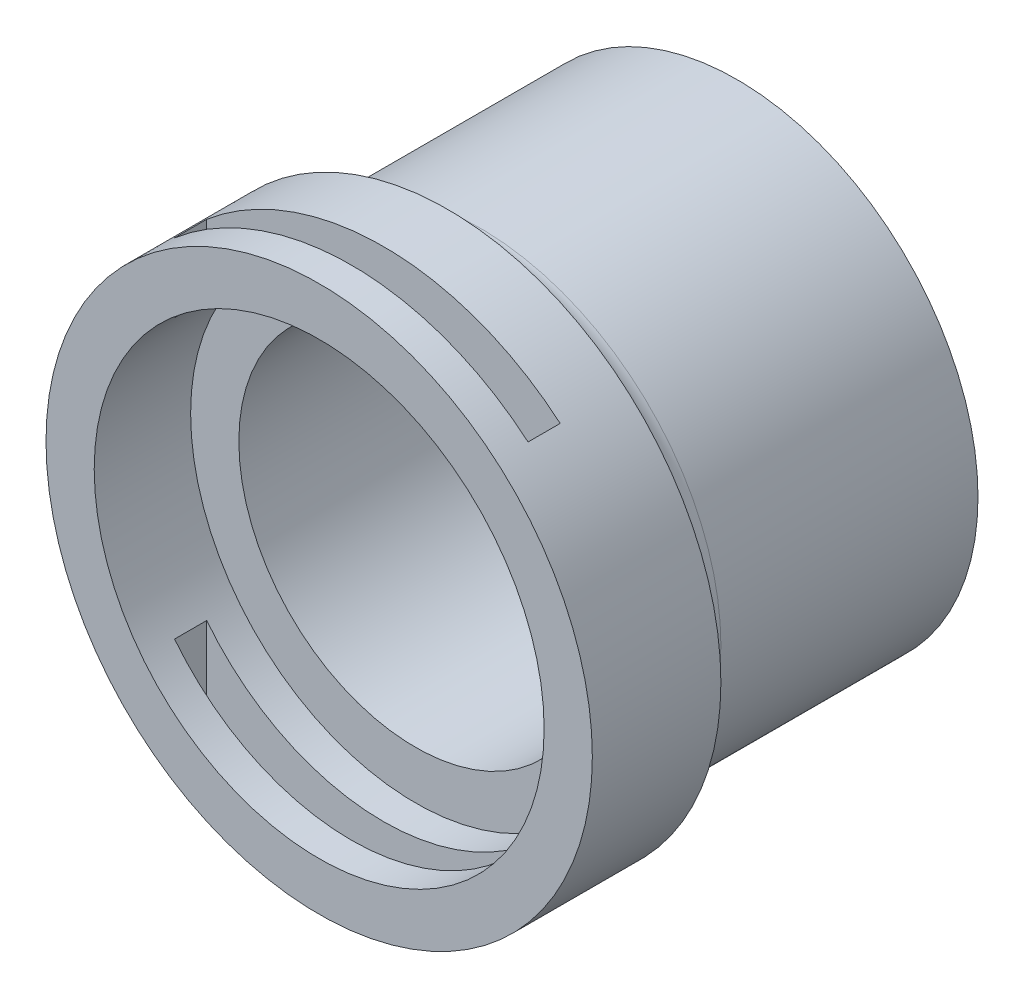
ISO-10303-21;
HEADER;
FILE_DESCRIPTION(('STEP AP214'),'2;1');
FILE_NAME('part.step','',(''),(''),'','','');
FILE_SCHEMA(('AUTOMOTIVE_DESIGN { 1 0 10303 214 1 1 1 1 }'));
ENDSEC;
DATA;
#1=APPLICATION_CONTEXT('core data for automotive mechanical design processes');
#2=APPLICATION_PROTOCOL_DEFINITION('international standard','automotive_design',2000,#1);
#3=PRODUCT_CONTEXT('',#1,'mechanical');
#4=PRODUCT('Part','Part','',(#3));
#5=PRODUCT_RELATED_PRODUCT_CATEGORY('part','',(#4));
#6=PRODUCT_DEFINITION_FORMATION('','',#4);
#7=PRODUCT_DEFINITION_CONTEXT('part definition',#1,'design');
#8=PRODUCT_DEFINITION('design','',#6,#7);
#9=PRODUCT_DEFINITION_SHAPE('','',#8);
#10=(LENGTH_UNIT() NAMED_UNIT(*) SI_UNIT(.MILLI.,.METRE.));
#11=(NAMED_UNIT(*) PLANE_ANGLE_UNIT() SI_UNIT($,.RADIAN.));
#12=(NAMED_UNIT(*) SI_UNIT($,.STERADIAN.) SOLID_ANGLE_UNIT());
#13=UNCERTAINTY_MEASURE_WITH_UNIT(LENGTH_MEASURE(1.E-05),#10,'distance_accuracy_value','');
#14=(GEOMETRIC_REPRESENTATION_CONTEXT(3) GLOBAL_UNCERTAINTY_ASSIGNED_CONTEXT((#13)) GLOBAL_UNIT_ASSIGNED_CONTEXT((#10,
#11,#12)) REPRESENTATION_CONTEXT('',''));
#15=CARTESIAN_POINT('',(0.,0.,0.));
#16=DIRECTION('',(0.,0.,1.));
#17=DIRECTION('',(1.,0.,0.));
#18=AXIS2_PLACEMENT_3D('',#15,#16,#17);
#19=CARTESIAN_POINT('',(0.,0.,0.));
#20=DIRECTION('',(0.,0.,1.));
#21=DIRECTION('',(1.,0.,0.));
#22=AXIS2_PLACEMENT_3D('',#19,#20,#21);
#23=PLANE('',#22);
#24=CARTESIAN_POINT('',(0.,10.,0.));
#25=DIRECTION('',(0.,0.,1.));
#26=DIRECTION('',(1.,0.,0.));
#27=AXIS2_PLACEMENT_3D('',#24,#25,#26);
#28=CIRCLE('',#27,0.5);
#29=CARTESIAN_POINT('',(0.5,10.,0.));
#30=VERTEX_POINT('',#29);
#31=EDGE_CURVE('E138',#30,#30,#28,.T.);
#32=ORIENTED_EDGE('',*,*,#31,.T.);
#33=EDGE_LOOP('',(#32));
#34=FACE_BOUND('',#33,.T.);
#35=CARTESIAN_POINT('',(0.,-10.,0.));
#36=DIRECTION('',(0.,0.,1.));
#37=DIRECTION('',(1.,0.,0.));
#38=AXIS2_PLACEMENT_3D('',#35,#36,#37);
#39=CIRCLE('',#38,0.5);
#40=CARTESIAN_POINT('',(0.5,-10.,0.));
#41=VERTEX_POINT('',#40);
#42=EDGE_CURVE('E146',#41,#41,#39,.T.);
#43=ORIENTED_EDGE('',*,*,#42,.T.);
#44=EDGE_LOOP('',(#43));
#45=FACE_BOUND('',#44,.T.);
#46=CARTESIAN_POINT('',(0.,0.,0.));
#47=DIRECTION('',(0.,0.,1.));
#48=DIRECTION('',(1.,0.,0.));
#49=AXIS2_PLACEMENT_3D('',#46,#47,#48);
#50=CIRCLE('',#49,5.625);
#51=CARTESIAN_POINT('',(5.625,0.,0.));
#52=VERTEX_POINT('',#51);
#53=EDGE_CURVE('E173',#52,#52,#50,.T.);
#54=ORIENTED_EDGE('',*,*,#53,.T.);
#55=EDGE_LOOP('',(#54));
#56=FACE_BOUND('',#55,.T.);
#57=CARTESIAN_POINT('',(0.,0.,0.));
#58=DIRECTION('',(0.,0.,1.));
#59=DIRECTION('',(1.,0.,0.));
#60=AXIS2_PLACEMENT_3D('',#57,#58,#59);
#61=CIRCLE('',#60,15.);
#62=CARTESIAN_POINT('',(15.,0.,0.));
#63=VERTEX_POINT('',#62);
#64=EDGE_CURVE('E176',#63,#63,#61,.T.);
#65=ORIENTED_EDGE('',*,*,#64,.F.);
#66=EDGE_LOOP('',(#65));
#67=FACE_BOUND('',#66,.T.);
#68=CARTESIAN_POINT('',(10.,0.,0.));
#69=DIRECTION('',(0.,0.,1.));
#70=DIRECTION('',(1.,0.,0.));
#71=AXIS2_PLACEMENT_3D('',#68,#69,#70);
#72=CIRCLE('',#71,0.500000000000001);
#73=CARTESIAN_POINT('',(10.5,0.,0.));
#74=VERTEX_POINT('',#73);
#75=EDGE_CURVE('E142',#74,#74,#72,.T.);
#76=ORIENTED_EDGE('',*,*,#75,.T.);
#77=EDGE_LOOP('',(#76));
#78=FACE_BOUND('',#77,.T.);
#79=CARTESIAN_POINT('',(-10.,0.,0.));
#80=DIRECTION('',(0.,0.,1.));
#81=DIRECTION('',(1.,0.,0.));
#82=AXIS2_PLACEMENT_3D('',#79,#80,#81);
#83=CIRCLE('',#82,0.500000000000001);
#84=CARTESIAN_POINT('',(-9.5,0.,0.));
#85=VERTEX_POINT('',#84);
#86=EDGE_CURVE('E134',#85,#85,#83,.T.);
#87=ORIENTED_EDGE('',*,*,#86,.T.);
#88=EDGE_LOOP('',(#87));
#89=FACE_BOUND('',#88,.T.);
#90=ADVANCED_FACE('F33',(#34,#45,#56,#67,#78,#89),#23,.F.);
#91=CARTESIAN_POINT('',(0.,0.,3.99999999999999));
#92=DIRECTION('',(0.,0.,1.));
#93=DIRECTION('',(1.,0.,0.));
#94=AXIS2_PLACEMENT_3D('',#91,#92,#93);
#95=PLANE('',#94);
#96=CARTESIAN_POINT('',(0.,10.,4.));
#97=DIRECTION('',(0.,0.,1.));
#98=DIRECTION('',(1.,0.,0.));
#99=AXIS2_PLACEMENT_3D('',#96,#97,#98);
#100=CIRCLE('',#99,0.5);
#101=CARTESIAN_POINT('',(0.5,10.,4.));
#102=VERTEX_POINT('',#101);
#103=EDGE_CURVE('E141',#102,#102,#100,.F.);
#104=ORIENTED_EDGE('',*,*,#103,.T.);
#105=EDGE_LOOP('',(#104));
#106=FACE_BOUND('',#105,.T.);
#107=CARTESIAN_POINT('',(0.,-10.,4.));
#108=DIRECTION('',(0.,0.,1.));
#109=DIRECTION('',(1.,0.,0.));
#110=AXIS2_PLACEMENT_3D('',#107,#108,#109);
#111=CIRCLE('',#110,0.5);
#112=CARTESIAN_POINT('',(0.5,-10.,4.));
#113=VERTEX_POINT('',#112);
#114=EDGE_CURVE('E149',#113,#113,#111,.F.);
#115=ORIENTED_EDGE('',*,*,#114,.T.);
#116=EDGE_LOOP('',(#115));
#117=FACE_BOUND('',#116,.T.);
#118=CARTESIAN_POINT('',(0.,0.,3.99999999999999));
#119=DIRECTION('',(0.,0.,1.));
#120=DIRECTION('',(1.,0.,0.));
#121=AXIS2_PLACEMENT_3D('',#118,#119,#120);
#122=CIRCLE('',#121,9.);
#123=CARTESIAN_POINT('',(9.,0.,3.99999999999999));
#124=VERTEX_POINT('',#123);
#125=EDGE_CURVE('E164',#124,#124,#122,.T.);
#126=ORIENTED_EDGE('',*,*,#125,.F.);
#127=EDGE_LOOP('',(#126));
#128=FACE_BOUND('',#127,.T.);
#129=CARTESIAN_POINT('',(0.,0.,3.99999999999999));
#130=DIRECTION('',(0.,0.,1.));
#131=DIRECTION('',(1.,0.,0.));
#132=AXIS2_PLACEMENT_3D('',#129,#130,#131);
#133=CIRCLE('',#132,11.);
#134=CARTESIAN_POINT('',(11.,0.,3.99999999999999));
#135=VERTEX_POINT('',#134);
#136=EDGE_CURVE('E167',#135,#135,#133,.T.);
#137=ORIENTED_EDGE('',*,*,#136,.T.);
#138=EDGE_LOOP('',(#137));
#139=FACE_BOUND('',#138,.T.);
#140=CARTESIAN_POINT('',(10.,0.,4.));
#141=DIRECTION('',(0.,0.,1.));
#142=DIRECTION('',(1.,0.,0.));
#143=AXIS2_PLACEMENT_3D('',#140,#141,#142);
#144=CIRCLE('',#143,0.500000000000001);
#145=CARTESIAN_POINT('',(10.5,0.,4.));
#146=VERTEX_POINT('',#145);
#147=EDGE_CURVE('E145',#146,#146,#144,.F.);
#148=ORIENTED_EDGE('',*,*,#147,.T.);
#149=EDGE_LOOP('',(#148));
#150=FACE_BOUND('',#149,.T.);
#151=CARTESIAN_POINT('',(-10.,0.,4.));
#152=DIRECTION('',(0.,0.,1.));
#153=DIRECTION('',(1.,0.,0.));
#154=AXIS2_PLACEMENT_3D('',#151,#152,#153);
#155=CIRCLE('',#154,0.500000000000001);
#156=CARTESIAN_POINT('',(-9.5,0.,4.));
#157=VERTEX_POINT('',#156);
#158=EDGE_CURVE('E137',#157,#157,#155,.F.);
#159=ORIENTED_EDGE('',*,*,#158,.T.);
#160=EDGE_LOOP('',(#159));
#161=FACE_BOUND('',#160,.T.);
#162=ADVANCED_FACE('F248',(#106,#117,#128,#139,#150,#161),#95,.T.);
#163=CARTESIAN_POINT('',(0.,0.,54.));
#164=DIRECTION('',(0.,0.,-1.));
#165=DIRECTION('',(-1.,0.,0.));
#166=AXIS2_PLACEMENT_3D('',#163,#164,#165);
#167=CYLINDRICAL_SURFACE('',#166,11.);
#168=ORIENTED_EDGE('',*,*,#136,.F.);
#169=EDGE_LOOP('',(#168));
#170=FACE_BOUND('',#169,.T.);
#171=CARTESIAN_POINT('',(0.,0.,20.));
#172=DIRECTION('',(0.,0.,1.));
#173=DIRECTION('',(1.,0.,0.));
#174=AXIS2_PLACEMENT_3D('',#171,#172,#173);
#175=CIRCLE('',#174,11.);
#176=CARTESIAN_POINT('',(11.,0.,20.));
#177=VERTEX_POINT('',#176);
#178=EDGE_CURVE('E153',#177,#177,#175,.T.);
#179=ORIENTED_EDGE('',*,*,#178,.T.);
#180=EDGE_LOOP('',(#179));
#181=FACE_BOUND('',#180,.T.);
#182=ADVANCED_FACE('F254',(#170,#181),#167,.F.);
#183=CARTESIAN_POINT('',(0.,0.,26.));
#184=DIRECTION('',(0.,0.,1.));
#185=DIRECTION('',(1.,0.,0.));
#186=AXIS2_PLACEMENT_3D('',#183,#184,#185);
#187=PLANE('',#186);
#188=CARTESIAN_POINT('',(0.,0.,26.));
#189=DIRECTION('',(0.,0.,1.));
#190=DIRECTION('',(1.,0.,0.));
#191=AXIS2_PLACEMENT_3D('',#188,#189,#190);
#192=CIRCLE('',#191,14.);
#193=CARTESIAN_POINT('',(14.,0.,26.));
#194=VERTEX_POINT('',#193);
#195=EDGE_CURVE('E154',#194,#194,#192,.T.);
#196=ORIENTED_EDGE('',*,*,#195,.F.);
#197=EDGE_LOOP('',(#196));
#198=FACE_BOUND('',#197,.T.);
#199=CARTESIAN_POINT('',(0.,0.,26.));
#200=DIRECTION('',(0.,0.,1.));
#201=DIRECTION('',(1.,0.,0.));
#202=AXIS2_PLACEMENT_3D('',#199,#200,#201);
#203=CIRCLE('',#202,17.);
#204=CARTESIAN_POINT('',(17.,0.,26.));
#205=VERTEX_POINT('',#204);
#206=EDGE_CURVE('E157',#205,#205,#203,.T.);
#207=ORIENTED_EDGE('',*,*,#206,.T.);
#208=EDGE_LOOP('',(#207));
#209=FACE_BOUND('',#208,.T.);
#210=ADVANCED_FACE('F259',(#198,#209),#187,.T.);
#211=CARTESIAN_POINT('',(0.,0.,26.));
#212=DIRECTION('',(0.,0.,-1.));
#213=DIRECTION('',(-1.,0.,0.));
#214=AXIS2_PLACEMENT_3D('',#211,#212,#213);
#215=CYLINDRICAL_SURFACE('',#214,15.);
#216=CARTESIAN_POINT('',(0.,0.,16.));
#217=DIRECTION('',(0.,0.,1.));
#218=DIRECTION('',(1.,0.,0.));
#219=AXIS2_PLACEMENT_3D('',#216,#217,#218);
#220=CIRCLE('',#219,15.);
#221=CARTESIAN_POINT('',(15.,0.,16.));
#222=VERTEX_POINT('',#221);
#223=EDGE_CURVE('E179',#222,#222,#220,.F.);
#224=ORIENTED_EDGE('',*,*,#223,.T.);
#225=EDGE_LOOP('',(#224));
#226=FACE_BOUND('',#225,.T.);
#227=ORIENTED_EDGE('',*,*,#64,.T.);
#228=EDGE_LOOP('',(#227));
#229=FACE_BOUND('',#228,.T.);
#230=ADVANCED_FACE('F261',(#226,#229),#215,.T.);
#231=CARTESIAN_POINT('',(0.,0.,5.99999999999999));
#232=DIRECTION('',(0.,0.,1.));
#233=DIRECTION('',(1.,0.,0.));
#234=AXIS2_PLACEMENT_3D('',#231,#232,#233);
#235=PLANE('',#234);
#236=CARTESIAN_POINT('',(0.,0.,5.99999999999999));
#237=DIRECTION('',(0.,0.,1.));
#238=DIRECTION('',(1.,0.,0.));
#239=AXIS2_PLACEMENT_3D('',#236,#237,#238);
#240=CIRCLE('',#239,5.625);
#241=CARTESIAN_POINT('',(5.625,0.,5.99999999999999));
#242=VERTEX_POINT('',#241);
#243=EDGE_CURVE('E172',#242,#242,#240,.F.);
#244=ORIENTED_EDGE('',*,*,#243,.T.);
#245=EDGE_LOOP('',(#244));
#246=FACE_BOUND('',#245,.T.);
#247=CARTESIAN_POINT('',(0.,0.,5.99999999999999));
#248=DIRECTION('',(0.,0.,1.));
#249=DIRECTION('',(1.,0.,0.));
#250=AXIS2_PLACEMENT_3D('',#247,#248,#249);
#251=CIRCLE('',#250,9.);
#252=CARTESIAN_POINT('',(9.,0.,5.99999999999999));
#253=VERTEX_POINT('',#252);
#254=EDGE_CURVE('E163',#253,#253,#251,.T.);
#255=ORIENTED_EDGE('',*,*,#254,.T.);
#256=EDGE_LOOP('',(#255));
#257=FACE_BOUND('',#256,.T.);
#258=ADVANCED_FACE('F263',(#246,#257),#235,.T.);
#259=CARTESIAN_POINT('',(0.,0.,0.));
#260=DIRECTION('',(0.,0.,1.));
#261=DIRECTION('',(1.,0.,0.));
#262=AXIS2_PLACEMENT_3D('',#259,#260,#261);
#263=CYLINDRICAL_SURFACE('',#262,5.625);
#264=ORIENTED_EDGE('',*,*,#53,.F.);
#265=EDGE_LOOP('',(#264));
#266=FACE_BOUND('',#265,.T.);
#267=ORIENTED_EDGE('',*,*,#243,.F.);
#268=EDGE_LOOP('',(#267));
#269=FACE_BOUND('',#268,.T.);
#270=ADVANCED_FACE('F269',(#266,#269),#263,.F.);
#271=CARTESIAN_POINT('',(0.,0.,3.99999999999999));
#272=DIRECTION('',(0.,0.,1.));
#273=DIRECTION('',(1.,0.,0.));
#274=AXIS2_PLACEMENT_3D('',#271,#272,#273);
#275=CYLINDRICAL_SURFACE('',#274,9.);
#276=ORIENTED_EDGE('',*,*,#125,.T.);
#277=EDGE_LOOP('',(#276));
#278=FACE_BOUND('',#277,.T.);
#279=ORIENTED_EDGE('',*,*,#254,.F.);
#280=EDGE_LOOP('',(#279));
#281=FACE_BOUND('',#280,.T.);
#282=ADVANCED_FACE('F310',(#278,#281),#275,.T.);
#283=CARTESIAN_POINT('',(0.,0.,18.));
#284=DIRECTION('',(0.,0.,1.));
#285=DIRECTION('',(1.,0.,0.));
#286=AXIS2_PLACEMENT_3D('',#283,#284,#285);
#287=CYLINDRICAL_SURFACE('',#286,17.);
#288=CARTESIAN_POINT('',(0.,0.,24.));
#289=DIRECTION('',(0.,0.,1.));
#290=DIRECTION('',(1.,0.,0.));
#291=AXIS2_PLACEMENT_3D('',#288,#289,#290);
#292=CIRCLE('',#291,17.);
#293=CARTESIAN_POINT('',(11.,-12.9614813968157,24.));
#294=VERTEX_POINT('',#293);
#295=CARTESIAN_POINT('',(-11.,-12.9614813968157,24.));
#296=VERTEX_POINT('',#295);
#297=EDGE_CURVE('E110',#294,#296,#292,.F.);
#298=ORIENTED_EDGE('',*,*,#297,.F.);
#299=DIRECTION('',(0.,0.,1.));
#300=VECTOR('',#299,1.);
#301=CARTESIAN_POINT('',(11.,-12.9614813968157,18.));
#302=LINE('',#301,#300);
#303=CARTESIAN_POINT('',(11.,-12.9614813968157,22.));
#304=VERTEX_POINT('',#303);
#305=EDGE_CURVE('E99',#304,#294,#302,.T.);
#306=ORIENTED_EDGE('',*,*,#305,.F.);
#307=CARTESIAN_POINT('',(0.,0.,22.));
#308=DIRECTION('',(0.,0.,-1.));
#309=DIRECTION('',(-1.,0.,0.));
#310=AXIS2_PLACEMENT_3D('',#307,#308,#309);
#311=CIRCLE('',#310,17.);
#312=CARTESIAN_POINT('',(-11.,-12.9614813968157,22.));
#313=VERTEX_POINT('',#312);
#314=EDGE_CURVE('E129',#313,#304,#311,.F.);
#315=ORIENTED_EDGE('',*,*,#314,.F.);
#316=DIRECTION('',(0.,0.,1.));
#317=VECTOR('',#316,1.);
#318=CARTESIAN_POINT('',(-11.,-12.9614813968157,18.));
#319=LINE('',#318,#317);
#320=EDGE_CURVE('E120',#296,#313,#319,.F.);
#321=ORIENTED_EDGE('',*,*,#320,.F.);
#322=EDGE_LOOP('',(#298,#306,#315,#321));
#323=FACE_BOUND('',#322,.T.);
#324=CARTESIAN_POINT('',(-11.,12.9614813968157,24.));
#325=VERTEX_POINT('',#324);
#326=CARTESIAN_POINT('',(11.,12.9614813968157,24.));
#327=VERTEX_POINT('',#326);
#328=EDGE_CURVE('E121',#325,#327,#292,.F.);
#329=ORIENTED_EDGE('',*,*,#328,.F.);
#330=DIRECTION('',(0.,0.,1.));
#331=VECTOR('',#330,1.);
#332=CARTESIAN_POINT('',(-11.,12.9614813968157,18.));
#333=LINE('',#332,#331);
#334=CARTESIAN_POINT('',(-11.,12.9614813968157,22.));
#335=VERTEX_POINT('',#334);
#336=EDGE_CURVE('E131',#335,#325,#333,.T.);
#337=ORIENTED_EDGE('',*,*,#336,.F.);
#338=CARTESIAN_POINT('',(11.,12.9614813968157,22.));
#339=VERTEX_POINT('',#338);
#340=EDGE_CURVE('E128',#339,#335,#311,.F.);
#341=ORIENTED_EDGE('',*,*,#340,.F.);
#342=DIRECTION('',(0.,0.,1.));
#343=VECTOR('',#342,1.);
#344=CARTESIAN_POINT('',(11.,12.9614813968157,18.));
#345=LINE('',#344,#343);
#346=EDGE_CURVE('E109',#327,#339,#345,.F.);
#347=ORIENTED_EDGE('',*,*,#346,.F.);
#348=EDGE_LOOP('',(#329,#337,#341,#347));
#349=FACE_BOUND('',#348,.T.);
#350=CARTESIAN_POINT('',(0.,0.,18.));
#351=DIRECTION('',(0.,0.,1.));
#352=DIRECTION('',(1.,0.,0.));
#353=AXIS2_PLACEMENT_3D('',#350,#351,#352);
#354=CIRCLE('',#353,17.);
#355=CARTESIAN_POINT('',(17.,0.,18.));
#356=VERTEX_POINT('',#355);
#357=EDGE_CURVE('E160',#356,#356,#354,.T.);
#358=ORIENTED_EDGE('',*,*,#357,.T.);
#359=EDGE_LOOP('',(#358));
#360=FACE_BOUND('',#359,.T.);
#361=ORIENTED_EDGE('',*,*,#206,.F.);
#362=EDGE_LOOP('',(#361));
#363=FACE_BOUND('',#362,.T.);
#364=ADVANCED_FACE('F118',(#323,#349,#360,#363),#287,.T.);
#365=CARTESIAN_POINT('',(0.,0.,16.));
#366=DIRECTION('',(0.,0.,1.));
#367=DIRECTION('',(1.,0.,0.));
#368=AXIS2_PLACEMENT_3D('',#365,#366,#367);
#369=TOROIDAL_SURFACE('',#368,17.,2.);
#370=ORIENTED_EDGE('',*,*,#223,.F.);
#371=EDGE_LOOP('',(#370));
#372=FACE_BOUND('',#371,.T.);
#373=ORIENTED_EDGE('',*,*,#357,.F.);
#374=EDGE_LOOP('',(#373));
#375=FACE_BOUND('',#374,.T.);
#376=ADVANCED_FACE('F35',(#372,#375),#369,.F.);
#377=CARTESIAN_POINT('',(0.,0.,20.));
#378=DIRECTION('',(0.,0.,1.));
#379=DIRECTION('',(1.,0.,0.));
#380=AXIS2_PLACEMENT_3D('',#377,#378,#379);
#381=CYLINDRICAL_SURFACE('',#380,14.);
#382=CARTESIAN_POINT('',(0.,0.,24.));
#383=DIRECTION('',(0.,0.,1.));
#384=DIRECTION('',(1.,0.,0.));
#385=AXIS2_PLACEMENT_3D('',#382,#383,#384);
#386=CIRCLE('',#385,14.);
#387=CARTESIAN_POINT('',(11.,-8.66025403784439,24.));
#388=VERTEX_POINT('',#387);
#389=CARTESIAN_POINT('',(-11.,-8.66025403784439,24.));
#390=VERTEX_POINT('',#389);
#391=EDGE_CURVE('E114',#388,#390,#386,.F.);
#392=ORIENTED_EDGE('',*,*,#391,.T.);
#393=DIRECTION('',(0.,0.,1.));
#394=VECTOR('',#393,1.);
#395=CARTESIAN_POINT('',(-11.,-8.66025403784439,20.));
#396=LINE('',#395,#394);
#397=CARTESIAN_POINT('',(-11.,-8.66025403784439,22.));
#398=VERTEX_POINT('',#397);
#399=EDGE_CURVE('E11',#390,#398,#396,.F.);
#400=ORIENTED_EDGE('',*,*,#399,.T.);
#401=CARTESIAN_POINT('',(0.,0.,22.));
#402=DIRECTION('',(0.,0.,-1.));
#403=DIRECTION('',(-1.,0.,0.));
#404=AXIS2_PLACEMENT_3D('',#401,#402,#403);
#405=CIRCLE('',#404,14.);
#406=CARTESIAN_POINT('',(11.,-8.66025403784439,22.));
#407=VERTEX_POINT('',#406);
#408=EDGE_CURVE('E41',#398,#407,#405,.F.);
#409=ORIENTED_EDGE('',*,*,#408,.T.);
#410=DIRECTION('',(0.,0.,1.));
#411=VECTOR('',#410,1.);
#412=CARTESIAN_POINT('',(11.,-8.66025403784439,20.));
#413=LINE('',#412,#411);
#414=EDGE_CURVE('E205',#407,#388,#413,.T.);
#415=ORIENTED_EDGE('',*,*,#414,.T.);
#416=EDGE_LOOP('',(#392,#400,#409,#415));
#417=FACE_BOUND('',#416,.T.);
#418=CARTESIAN_POINT('',(11.,8.66025403784439,22.));
#419=VERTEX_POINT('',#418);
#420=CARTESIAN_POINT('',(-11.,8.66025403784439,22.));
#421=VERTEX_POINT('',#420);
#422=EDGE_CURVE('E200',#419,#421,#405,.F.);
#423=ORIENTED_EDGE('',*,*,#422,.T.);
#424=DIRECTION('',(0.,0.,1.));
#425=VECTOR('',#424,1.);
#426=CARTESIAN_POINT('',(-11.,8.66025403784439,20.));
#427=LINE('',#426,#425);
#428=CARTESIAN_POINT('',(-11.,8.66025403784439,24.));
#429=VERTEX_POINT('',#428);
#430=EDGE_CURVE('E203',#421,#429,#427,.T.);
#431=ORIENTED_EDGE('',*,*,#430,.T.);
#432=CARTESIAN_POINT('',(11.,8.66025403784439,24.));
#433=VERTEX_POINT('',#432);
#434=EDGE_CURVE('E184',#429,#433,#386,.F.);
#435=ORIENTED_EDGE('',*,*,#434,.T.);
#436=DIRECTION('',(0.,0.,1.));
#437=VECTOR('',#436,1.);
#438=CARTESIAN_POINT('',(11.,8.66025403784439,20.));
#439=LINE('',#438,#437);
#440=EDGE_CURVE('E197',#433,#419,#439,.F.);
#441=ORIENTED_EDGE('',*,*,#440,.T.);
#442=EDGE_LOOP('',(#423,#431,#435,#441));
#443=FACE_BOUND('',#442,.T.);
#444=CARTESIAN_POINT('',(0.,0.,20.));
#445=DIRECTION('',(0.,0.,1.));
#446=DIRECTION('',(1.,0.,0.));
#447=AXIS2_PLACEMENT_3D('',#444,#445,#446);
#448=CIRCLE('',#447,14.);
#449=CARTESIAN_POINT('',(14.,0.,20.));
#450=VERTEX_POINT('',#449);
#451=EDGE_CURVE('E150',#450,#450,#448,.T.);
#452=ORIENTED_EDGE('',*,*,#451,.F.);
#453=EDGE_LOOP('',(#452));
#454=FACE_BOUND('',#453,.T.);
#455=ORIENTED_EDGE('',*,*,#195,.T.);
#456=EDGE_LOOP('',(#455));
#457=FACE_BOUND('',#456,.T.);
#458=ADVANCED_FACE('F208',(#417,#443,#454,#457),#381,.F.);
#459=CARTESIAN_POINT('',(0.,0.,20.));
#460=DIRECTION('',(0.,0.,1.));
#461=DIRECTION('',(1.,0.,0.));
#462=AXIS2_PLACEMENT_3D('',#459,#460,#461);
#463=PLANE('',#462);
#464=ORIENTED_EDGE('',*,*,#178,.F.);
#465=EDGE_LOOP('',(#464));
#466=FACE_BOUND('',#465,.T.);
#467=ORIENTED_EDGE('',*,*,#451,.T.);
#468=EDGE_LOOP('',(#467));
#469=FACE_BOUND('',#468,.T.);
#470=ADVANCED_FACE('F301',(#466,#469),#463,.T.);
#471=CARTESIAN_POINT('',(0.,-10.,26.));
#472=DIRECTION('',(0.,0.,-1.));
#473=DIRECTION('',(-1.,0.,0.));
#474=AXIS2_PLACEMENT_3D('',#471,#472,#473);
#475=CYLINDRICAL_SURFACE('',#474,0.5);
#476=ORIENTED_EDGE('',*,*,#114,.F.);
#477=EDGE_LOOP('',(#476));
#478=FACE_BOUND('',#477,.T.);
#479=ORIENTED_EDGE('',*,*,#42,.F.);
#480=EDGE_LOOP('',(#479));
#481=FACE_BOUND('',#480,.T.);
#482=ADVANCED_FACE('F297',(#478,#481),#475,.F.);
#483=CARTESIAN_POINT('',(10.,0.,26.));
#484=DIRECTION('',(0.,0.,-1.));
#485=DIRECTION('',(-1.,0.,0.));
#486=AXIS2_PLACEMENT_3D('',#483,#484,#485);
#487=CYLINDRICAL_SURFACE('',#486,0.500000000000001);
#488=ORIENTED_EDGE('',*,*,#147,.F.);
#489=EDGE_LOOP('',(#488));
#490=FACE_BOUND('',#489,.T.);
#491=ORIENTED_EDGE('',*,*,#75,.F.);
#492=EDGE_LOOP('',(#491));
#493=FACE_BOUND('',#492,.T.);
#494=ADVANCED_FACE('F290',(#490,#493),#487,.F.);
#495=CARTESIAN_POINT('',(0.,10.,26.));
#496=DIRECTION('',(0.,0.,-1.));
#497=DIRECTION('',(-1.,0.,0.));
#498=AXIS2_PLACEMENT_3D('',#495,#496,#497);
#499=CYLINDRICAL_SURFACE('',#498,0.5);
#500=ORIENTED_EDGE('',*,*,#103,.F.);
#501=EDGE_LOOP('',(#500));
#502=FACE_BOUND('',#501,.T.);
#503=ORIENTED_EDGE('',*,*,#31,.F.);
#504=EDGE_LOOP('',(#503));
#505=FACE_BOUND('',#504,.T.);
#506=ADVANCED_FACE('F284',(#502,#505),#499,.F.);
#507=CARTESIAN_POINT('',(-10.,0.,26.));
#508=DIRECTION('',(0.,0.,-1.));
#509=DIRECTION('',(-1.,0.,0.));
#510=AXIS2_PLACEMENT_3D('',#507,#508,#509);
#511=CYLINDRICAL_SURFACE('',#510,0.500000000000001);
#512=ORIENTED_EDGE('',*,*,#158,.F.);
#513=EDGE_LOOP('',(#512));
#514=FACE_BOUND('',#513,.T.);
#515=ORIENTED_EDGE('',*,*,#86,.F.);
#516=EDGE_LOOP('',(#515));
#517=FACE_BOUND('',#516,.T.);
#518=ADVANCED_FACE('F282',(#514,#517),#511,.F.);
#519=CARTESIAN_POINT('',(11.,-17.,24.));
#520=DIRECTION('',(0.,0.,1.));
#521=DIRECTION('',(1.,0.,0.));
#522=AXIS2_PLACEMENT_3D('',#519,#520,#521);
#523=PLANE('',#522);
#524=ORIENTED_EDGE('',*,*,#328,.T.);
#525=DIRECTION('',(0.,1.,0.));
#526=VECTOR('',#525,1.);
#527=CARTESIAN_POINT('',(11.,-17.,24.));
#528=LINE('',#527,#526);
#529=EDGE_CURVE('E56',#433,#327,#528,.T.);
#530=ORIENTED_EDGE('',*,*,#529,.F.);
#531=ORIENTED_EDGE('',*,*,#434,.F.);
#532=DIRECTION('',(0.,1.,0.));
#533=VECTOR('',#532,1.);
#534=CARTESIAN_POINT('',(-11.,-17.,24.));
#535=LINE('',#534,#533);
#536=EDGE_CURVE('E125',#429,#325,#535,.T.);
#537=ORIENTED_EDGE('',*,*,#536,.T.);
#538=EDGE_LOOP('',(#524,#530,#531,#537));
#539=FACE_BOUND('',#538,.T.);
#540=ADVANCED_FACE('F225',(#539),#523,.F.);
#541=CARTESIAN_POINT('',(11.,-17.,22.));
#542=DIRECTION('',(1.,0.,0.));
#543=DIRECTION('',(0.,0.,-1.));
#544=AXIS2_PLACEMENT_3D('',#541,#542,#543);
#545=PLANE('',#544);
#546=ORIENTED_EDGE('',*,*,#346,.T.);
#547=DIRECTION('',(0.,1.,0.));
#548=VECTOR('',#547,1.);
#549=CARTESIAN_POINT('',(11.,-17.,22.));
#550=LINE('',#549,#548);
#551=EDGE_CURVE('E115',#419,#339,#550,.T.);
#552=ORIENTED_EDGE('',*,*,#551,.F.);
#553=ORIENTED_EDGE('',*,*,#440,.F.);
#554=ORIENTED_EDGE('',*,*,#529,.T.);
#555=EDGE_LOOP('',(#546,#552,#553,#554));
#556=FACE_BOUND('',#555,.T.);
#557=ADVANCED_FACE('F231',(#556),#545,.F.);
#558=CARTESIAN_POINT('',(11.,-17.,22.));
#559=DIRECTION('',(0.,0.,-1.));
#560=DIRECTION('',(-1.,0.,0.));
#561=AXIS2_PLACEMENT_3D('',#558,#559,#560);
#562=PLANE('',#561);
#563=ORIENTED_EDGE('',*,*,#340,.T.);
#564=DIRECTION('',(0.,1.,0.));
#565=VECTOR('',#564,1.);
#566=CARTESIAN_POINT('',(-11.,-17.,22.));
#567=LINE('',#566,#565);
#568=EDGE_CURVE('E215',#421,#335,#567,.T.);
#569=ORIENTED_EDGE('',*,*,#568,.F.);
#570=ORIENTED_EDGE('',*,*,#422,.F.);
#571=ORIENTED_EDGE('',*,*,#551,.T.);
#572=EDGE_LOOP('',(#563,#569,#570,#571));
#573=FACE_BOUND('',#572,.T.);
#574=ADVANCED_FACE('F233',(#573),#562,.F.);
#575=CARTESIAN_POINT('',(-11.,-17.,22.));
#576=DIRECTION('',(-1.,0.,0.));
#577=DIRECTION('',(0.,0.,1.));
#578=AXIS2_PLACEMENT_3D('',#575,#576,#577);
#579=PLANE('',#578);
#580=ORIENTED_EDGE('',*,*,#336,.T.);
#581=ORIENTED_EDGE('',*,*,#536,.F.);
#582=ORIENTED_EDGE('',*,*,#430,.F.);
#583=ORIENTED_EDGE('',*,*,#568,.T.);
#584=EDGE_LOOP('',(#580,#581,#582,#583));
#585=FACE_BOUND('',#584,.T.);
#586=ADVANCED_FACE('F236',(#585),#579,.F.);
#587=ORIENTED_EDGE('',*,*,#320,.T.);
#588=EDGE_CURVE('E123',#313,#398,#567,.T.);
#589=ORIENTED_EDGE('',*,*,#588,.T.);
#590=ORIENTED_EDGE('',*,*,#399,.F.);
#591=EDGE_CURVE('E48',#296,#390,#535,.T.);
#592=ORIENTED_EDGE('',*,*,#591,.F.);
#593=EDGE_LOOP('',(#587,#589,#590,#592));
#594=FACE_BOUND('',#593,.T.);
#595=ADVANCED_FACE('F212',(#594),#579,.F.);
#596=ORIENTED_EDGE('',*,*,#314,.T.);
#597=EDGE_CURVE('E105',#304,#407,#550,.T.);
#598=ORIENTED_EDGE('',*,*,#597,.T.);
#599=ORIENTED_EDGE('',*,*,#408,.F.);
#600=ORIENTED_EDGE('',*,*,#588,.F.);
#601=EDGE_LOOP('',(#596,#598,#599,#600));
#602=FACE_BOUND('',#601,.T.);
#603=ADVANCED_FACE('F243',(#602),#562,.F.);
#604=ORIENTED_EDGE('',*,*,#305,.T.);
#605=EDGE_CURVE('E102',#294,#388,#528,.T.);
#606=ORIENTED_EDGE('',*,*,#605,.T.);
#607=ORIENTED_EDGE('',*,*,#414,.F.);
#608=ORIENTED_EDGE('',*,*,#597,.F.);
#609=EDGE_LOOP('',(#604,#606,#607,#608));
#610=FACE_BOUND('',#609,.T.);
#611=ADVANCED_FACE('F101',(#610),#545,.F.);
#612=ORIENTED_EDGE('',*,*,#297,.T.);
#613=ORIENTED_EDGE('',*,*,#591,.T.);
#614=ORIENTED_EDGE('',*,*,#391,.F.);
#615=ORIENTED_EDGE('',*,*,#605,.F.);
#616=EDGE_LOOP('',(#612,#613,#614,#615));
#617=FACE_BOUND('',#616,.T.);
#618=ADVANCED_FACE('F112',(#617),#523,.F.);
#619=CLOSED_SHELL('',(#90,#162,#182,#210,#230,#258,#270,#282,#364,#376,#458,#470,#482,#494,#506,
#518,#540,#557,#574,#586,#595,#603,#611,#618));
#620=MANIFOLD_SOLID_BREP('B2',#619);
#621=ADVANCED_BREP_SHAPE_REPRESENTATION('',(#18,#620),#14);
#622=SHAPE_DEFINITION_REPRESENTATION(#9,#621);
ENDSEC;
END-ISO-10303-21;
